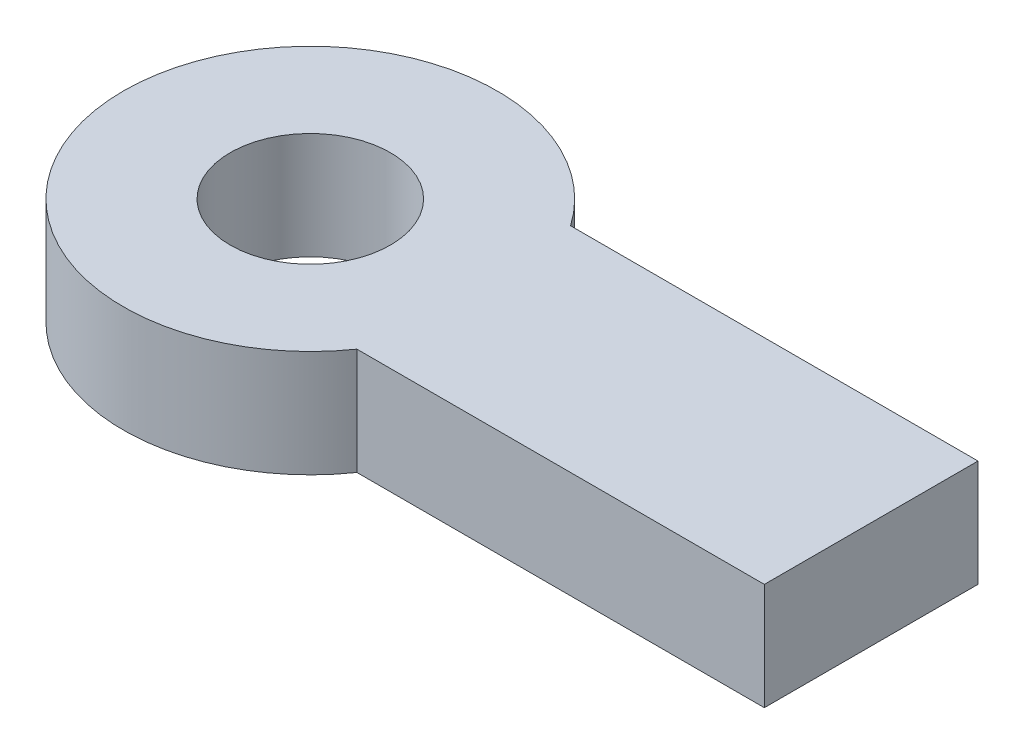
ISO-10303-21;
HEADER;
FILE_DESCRIPTION(('STEP AP214'),'2;1');
FILE_NAME('part.step','',(''),(''),'','','');
FILE_SCHEMA(('AUTOMOTIVE_DESIGN { 1 0 10303 214 1 1 1 1 }'));
ENDSEC;
DATA;
#1=APPLICATION_CONTEXT('core data for automotive mechanical design processes');
#2=APPLICATION_PROTOCOL_DEFINITION('international standard','automotive_design',2000,#1);
#3=PRODUCT_CONTEXT('',#1,'mechanical');
#4=PRODUCT('Part','Part','',(#3));
#5=PRODUCT_RELATED_PRODUCT_CATEGORY('part','',(#4));
#6=PRODUCT_DEFINITION_FORMATION('','',#4);
#7=PRODUCT_DEFINITION_CONTEXT('part definition',#1,'design');
#8=PRODUCT_DEFINITION('design','',#6,#7);
#9=PRODUCT_DEFINITION_SHAPE('','',#8);
#10=(LENGTH_UNIT() NAMED_UNIT(*) SI_UNIT(.MILLI.,.METRE.));
#11=(NAMED_UNIT(*) PLANE_ANGLE_UNIT() SI_UNIT($,.RADIAN.));
#12=(NAMED_UNIT(*) SI_UNIT($,.STERADIAN.) SOLID_ANGLE_UNIT());
#13=UNCERTAINTY_MEASURE_WITH_UNIT(LENGTH_MEASURE(1.E-05),#10,'distance_accuracy_value','');
#14=(GEOMETRIC_REPRESENTATION_CONTEXT(3) GLOBAL_UNCERTAINTY_ASSIGNED_CONTEXT((#13)) GLOBAL_UNIT_ASSIGNED_CONTEXT((#10,
#11,#12)) REPRESENTATION_CONTEXT('',''));
#15=CARTESIAN_POINT('',(0.,0.,0.));
#16=DIRECTION('',(0.,0.,1.));
#17=DIRECTION('',(1.,0.,0.));
#18=AXIS2_PLACEMENT_3D('',#15,#16,#17);
#19=CARTESIAN_POINT('',(0.,2.,0.));
#20=DIRECTION('',(0.,1.,0.));
#21=DIRECTION('',(0.,0.,1.));
#22=AXIS2_PLACEMENT_3D('',#19,#20,#21);
#23=PLANE('',#22);
#24=DIRECTION('',(-1.,0.,0.));
#25=VECTOR('',#24,1.);
#26=CARTESIAN_POINT('',(3.5,2.,-2.));
#27=LINE('',#26,#25);
#28=CARTESIAN_POINT('',(10.5,2.,-2.));
#29=VERTEX_POINT('',#28);
#30=CARTESIAN_POINT('',(2.87228132326901,2.,-2.));
#31=VERTEX_POINT('',#30);
#32=EDGE_CURVE('E57',#29,#31,#27,.T.);
#33=ORIENTED_EDGE('',*,*,#32,.T.);
#34=CARTESIAN_POINT('',(0.,2.,0.));
#35=DIRECTION('',(0.,1.,0.));
#36=DIRECTION('',(0.,0.,1.));
#37=AXIS2_PLACEMENT_3D('',#34,#35,#36);
#38=CIRCLE('',#37,3.5);
#39=CARTESIAN_POINT('',(2.87228132326901,2.,2.));
#40=VERTEX_POINT('',#39);
#41=EDGE_CURVE('E87',#31,#40,#38,.T.);
#42=ORIENTED_EDGE('',*,*,#41,.T.);
#43=DIRECTION('',(1.,0.,0.));
#44=VECTOR('',#43,1.);
#45=CARTESIAN_POINT('',(3.5,2.,2.));
#46=LINE('',#45,#44);
#47=CARTESIAN_POINT('',(10.5,2.,2.));
#48=VERTEX_POINT('',#47);
#49=EDGE_CURVE('E91',#40,#48,#46,.T.);
#50=ORIENTED_EDGE('',*,*,#49,.T.);
#51=DIRECTION('',(0.,0.,-1.));
#52=VECTOR('',#51,1.);
#53=CARTESIAN_POINT('',(10.5,2.,-2.));
#54=LINE('',#53,#52);
#55=EDGE_CURVE('E102',#48,#29,#54,.T.);
#56=ORIENTED_EDGE('',*,*,#55,.T.);
#57=EDGE_LOOP('',(#33,#42,#50,#56));
#58=FACE_BOUND('',#57,.T.);
#59=CARTESIAN_POINT('',(0.,2.,0.));
#60=DIRECTION('',(0.,1.,0.));
#61=DIRECTION('',(0.,0.,1.));
#62=AXIS2_PLACEMENT_3D('',#59,#60,#61);
#63=CIRCLE('',#62,1.5);
#64=CARTESIAN_POINT('',(0.,2.,1.5));
#65=VERTEX_POINT('',#64);
#66=EDGE_CURVE('E111',#65,#65,#63,.T.);
#67=ORIENTED_EDGE('',*,*,#66,.F.);
#68=EDGE_LOOP('',(#67));
#69=FACE_BOUND('',#68,.T.);
#70=ADVANCED_FACE('F39',(#58,#69),#23,.T.);
#71=CARTESIAN_POINT('',(0.,0.,0.));
#72=DIRECTION('',(0.,1.,0.));
#73=DIRECTION('',(0.,0.,1.));
#74=AXIS2_PLACEMENT_3D('',#71,#72,#73);
#75=PLANE('',#74);
#76=CARTESIAN_POINT('',(0.,0.,0.));
#77=DIRECTION('',(0.,1.,0.));
#78=DIRECTION('',(0.,0.,1.));
#79=AXIS2_PLACEMENT_3D('',#76,#77,#78);
#80=CIRCLE('',#79,3.5);
#81=CARTESIAN_POINT('',(2.87228132326901,0.,-2.));
#82=VERTEX_POINT('',#81);
#83=CARTESIAN_POINT('',(2.87228132326901,0.,2.));
#84=VERTEX_POINT('',#83);
#85=EDGE_CURVE('E96',#82,#84,#80,.T.);
#86=ORIENTED_EDGE('',*,*,#85,.F.);
#87=DIRECTION('',(-1.,0.,0.));
#88=VECTOR('',#87,1.);
#89=CARTESIAN_POINT('',(3.5,0.,-2.));
#90=LINE('',#89,#88);
#91=CARTESIAN_POINT('',(10.5,0.,-2.));
#92=VERTEX_POINT('',#91);
#93=EDGE_CURVE('E116',#92,#82,#90,.T.);
#94=ORIENTED_EDGE('',*,*,#93,.F.);
#95=DIRECTION('',(0.,0.,-1.));
#96=VECTOR('',#95,1.);
#97=CARTESIAN_POINT('',(10.5,0.,-2.));
#98=LINE('',#97,#96);
#99=CARTESIAN_POINT('',(10.5,0.,2.));
#100=VERTEX_POINT('',#99);
#101=EDGE_CURVE('E81',#100,#92,#98,.T.);
#102=ORIENTED_EDGE('',*,*,#101,.F.);
#103=DIRECTION('',(1.,0.,0.));
#104=VECTOR('',#103,1.);
#105=CARTESIAN_POINT('',(3.5,0.,2.));
#106=LINE('',#105,#104);
#107=EDGE_CURVE('E74',#84,#100,#106,.T.);
#108=ORIENTED_EDGE('',*,*,#107,.F.);
#109=EDGE_LOOP('',(#86,#94,#102,#108));
#110=FACE_BOUND('',#109,.T.);
#111=CARTESIAN_POINT('',(0.,0.,0.));
#112=DIRECTION('',(0.,1.,0.));
#113=DIRECTION('',(0.,0.,1.));
#114=AXIS2_PLACEMENT_3D('',#111,#112,#113);
#115=CIRCLE('',#114,1.5);
#116=CARTESIAN_POINT('',(0.,0.,1.5));
#117=VERTEX_POINT('',#116);
#118=EDGE_CURVE('E195',#117,#117,#115,.T.);
#119=ORIENTED_EDGE('',*,*,#118,.T.);
#120=EDGE_LOOP('',(#119));
#121=FACE_BOUND('',#120,.T.);
#122=ADVANCED_FACE('F125',(#110,#121),#75,.F.);
#123=CARTESIAN_POINT('',(0.,2.,0.));
#124=DIRECTION('',(0.,-1.,0.));
#125=DIRECTION('',(0.,0.,-1.));
#126=AXIS2_PLACEMENT_3D('',#123,#124,#125);
#127=CYLINDRICAL_SURFACE('',#126,3.5);
#128=ORIENTED_EDGE('',*,*,#85,.T.);
#129=DIRECTION('',(0.,-1.,0.));
#130=VECTOR('',#129,1.);
#131=CARTESIAN_POINT('',(2.87228132326901,2.,2.));
#132=LINE('',#131,#130);
#133=EDGE_CURVE('E49',#40,#84,#132,.T.);
#134=ORIENTED_EDGE('',*,*,#133,.F.);
#135=ORIENTED_EDGE('',*,*,#41,.F.);
#136=DIRECTION('',(0.,-1.,0.));
#137=VECTOR('',#136,1.);
#138=CARTESIAN_POINT('',(2.87228132326901,2.,-2.));
#139=LINE('',#138,#137);
#140=EDGE_CURVE('E11',#31,#82,#139,.T.);
#141=ORIENTED_EDGE('',*,*,#140,.T.);
#142=EDGE_LOOP('',(#128,#134,#135,#141));
#143=FACE_BOUND('',#142,.T.);
#144=ADVANCED_FACE('F41',(#143),#127,.T.);
#145=CARTESIAN_POINT('',(3.5,2.,2.));
#146=DIRECTION('',(0.,0.,-1.));
#147=DIRECTION('',(-1.,0.,0.));
#148=AXIS2_PLACEMENT_3D('',#145,#146,#147);
#149=PLANE('',#148);
#150=ORIENTED_EDGE('',*,*,#107,.T.);
#151=DIRECTION('',(0.,-1.,0.));
#152=VECTOR('',#151,1.);
#153=CARTESIAN_POINT('',(10.5,2.,2.));
#154=LINE('',#153,#152);
#155=EDGE_CURVE('E98',#48,#100,#154,.T.);
#156=ORIENTED_EDGE('',*,*,#155,.F.);
#157=ORIENTED_EDGE('',*,*,#49,.F.);
#158=ORIENTED_EDGE('',*,*,#133,.T.);
#159=EDGE_LOOP('',(#150,#156,#157,#158));
#160=FACE_BOUND('',#159,.T.);
#161=ADVANCED_FACE('F99',(#160),#149,.F.);
#162=CARTESIAN_POINT('',(10.5,2.,-2.));
#163=DIRECTION('',(-1.,0.,0.));
#164=DIRECTION('',(0.,0.,1.));
#165=AXIS2_PLACEMENT_3D('',#162,#163,#164);
#166=PLANE('',#165);
#167=ORIENTED_EDGE('',*,*,#101,.T.);
#168=DIRECTION('',(0.,-1.,0.));
#169=VECTOR('',#168,1.);
#170=CARTESIAN_POINT('',(10.5,2.,-2.));
#171=LINE('',#170,#169);
#172=EDGE_CURVE('E105',#29,#92,#171,.T.);
#173=ORIENTED_EDGE('',*,*,#172,.F.);
#174=ORIENTED_EDGE('',*,*,#55,.F.);
#175=ORIENTED_EDGE('',*,*,#155,.T.);
#176=EDGE_LOOP('',(#167,#173,#174,#175));
#177=FACE_BOUND('',#176,.T.);
#178=ADVANCED_FACE('F122',(#177),#166,.F.);
#179=CARTESIAN_POINT('',(3.5,2.,-2.));
#180=DIRECTION('',(0.,0.,1.));
#181=DIRECTION('',(1.,0.,0.));
#182=AXIS2_PLACEMENT_3D('',#179,#180,#181);
#183=PLANE('',#182);
#184=ORIENTED_EDGE('',*,*,#93,.T.);
#185=ORIENTED_EDGE('',*,*,#140,.F.);
#186=ORIENTED_EDGE('',*,*,#32,.F.);
#187=ORIENTED_EDGE('',*,*,#172,.T.);
#188=EDGE_LOOP('',(#184,#185,#186,#187));
#189=FACE_BOUND('',#188,.T.);
#190=ADVANCED_FACE('F127',(#189),#183,.F.);
#191=CARTESIAN_POINT('',(0.,2.,0.));
#192=DIRECTION('',(0.,-1.,0.));
#193=DIRECTION('',(0.,0.,-1.));
#194=AXIS2_PLACEMENT_3D('',#191,#192,#193);
#195=CYLINDRICAL_SURFACE('',#194,1.5);
#196=ORIENTED_EDGE('',*,*,#66,.T.);
#197=EDGE_LOOP('',(#196));
#198=FACE_BOUND('',#197,.T.);
#199=ORIENTED_EDGE('',*,*,#118,.F.);
#200=EDGE_LOOP('',(#199));
#201=FACE_BOUND('',#200,.T.);
#202=ADVANCED_FACE('F129',(#198,#201),#195,.F.);
#203=CLOSED_SHELL('',(#70,#122,#144,#161,#178,#190,#202));
#204=MANIFOLD_SOLID_BREP('B2',#203);
#205=ADVANCED_BREP_SHAPE_REPRESENTATION('',(#18,#204),#14);
#206=SHAPE_DEFINITION_REPRESENTATION(#9,#205);
ENDSEC;
END-ISO-10303-21;
